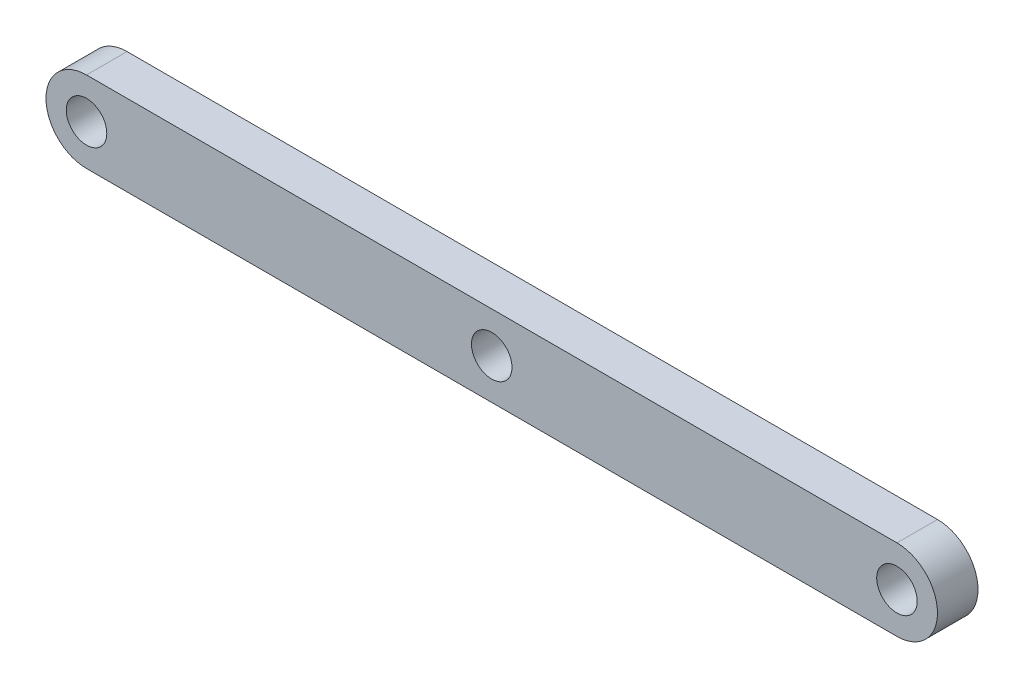
ISO-10303-21;
HEADER;
FILE_DESCRIPTION(('STEP AP214'),'2;1');
FILE_NAME('part.step','',(''),(''),'','','');
FILE_SCHEMA(('AUTOMOTIVE_DESIGN { 1 0 10303 214 1 1 1 1 }'));
ENDSEC;
DATA;
#1=APPLICATION_CONTEXT('core data for automotive mechanical design processes');
#2=APPLICATION_PROTOCOL_DEFINITION('international standard','automotive_design',2000,#1);
#3=PRODUCT_CONTEXT('',#1,'mechanical');
#4=PRODUCT('Part','Part','',(#3));
#5=PRODUCT_RELATED_PRODUCT_CATEGORY('part','',(#4));
#6=PRODUCT_DEFINITION_FORMATION('','',#4);
#7=PRODUCT_DEFINITION_CONTEXT('part definition',#1,'design');
#8=PRODUCT_DEFINITION('design','',#6,#7);
#9=PRODUCT_DEFINITION_SHAPE('','',#8);
#10=(LENGTH_UNIT() NAMED_UNIT(*) SI_UNIT(.MILLI.,.METRE.));
#11=(NAMED_UNIT(*) PLANE_ANGLE_UNIT() SI_UNIT($,.RADIAN.));
#12=(NAMED_UNIT(*) SI_UNIT($,.STERADIAN.) SOLID_ANGLE_UNIT());
#13=UNCERTAINTY_MEASURE_WITH_UNIT(LENGTH_MEASURE(1.E-05),#10,'distance_accuracy_value','');
#14=(GEOMETRIC_REPRESENTATION_CONTEXT(3) GLOBAL_UNCERTAINTY_ASSIGNED_CONTEXT((#13)) GLOBAL_UNIT_ASSIGNED_CONTEXT((#10,
#11,#12)) REPRESENTATION_CONTEXT('',''));
#15=CARTESIAN_POINT('',(0.,0.,0.));
#16=DIRECTION('',(0.,0.,1.));
#17=DIRECTION('',(1.,0.,0.));
#18=AXIS2_PLACEMENT_3D('',#15,#16,#17);
#19=CARTESIAN_POINT('',(-19.999999973377,0.00103195035295043,2.));
#20=DIRECTION('',(0.,0.,1.));
#21=DIRECTION('',(1.,0.,0.));
#22=AXIS2_PLACEMENT_3D('',#19,#20,#21);
#23=PLANE('',#22);
#24=CARTESIAN_POINT('',(20.000000026623,0.00103195035295043,2.));
#25=DIRECTION('',(0.,0.,1.));
#26=DIRECTION('',(1.,0.,0.));
#27=AXIS2_PLACEMENT_3D('',#24,#25,#26);
#28=CIRCLE('',#27,1.);
#29=CARTESIAN_POINT('',(21.000000026623,0.00103195035295043,2.));
#30=VERTEX_POINT('',#29);
#31=EDGE_CURVE('E115',#30,#30,#28,.T.);
#32=ORIENTED_EDGE('',*,*,#31,.F.);
#33=EDGE_LOOP('',(#32));
#34=FACE_BOUND('',#33,.T.);
#35=CARTESIAN_POINT('',(-19.999999973377,0.00103195035295043,2.));
#36=DIRECTION('',(0.,0.,1.));
#37=DIRECTION('',(1.,0.,0.));
#38=AXIS2_PLACEMENT_3D('',#35,#36,#37);
#39=CIRCLE('',#38,2.);
#40=CARTESIAN_POINT('',(-19.999999973377,2.00103195035295,2.));
#41=VERTEX_POINT('',#40);
#42=CARTESIAN_POINT('',(-19.999999973377,-1.99896804964705,2.));
#43=VERTEX_POINT('',#42);
#44=EDGE_CURVE('E85',#41,#43,#39,.T.);
#45=ORIENTED_EDGE('',*,*,#44,.T.);
#46=DIRECTION('',(1.,0.,0.));
#47=VECTOR('',#46,1.);
#48=CARTESIAN_POINT('',(-19.999999973377,-1.99896804964705,2.));
#49=LINE('',#48,#47);
#50=CARTESIAN_POINT('',(20.000000026623,-1.99896804964705,2.));
#51=VERTEX_POINT('',#50);
#52=EDGE_CURVE('E80',#43,#51,#49,.T.);
#53=ORIENTED_EDGE('',*,*,#52,.T.);
#54=CARTESIAN_POINT('',(20.000000026623,0.00103195035295043,2.));
#55=DIRECTION('',(0.,0.,1.));
#56=DIRECTION('',(1.,0.,0.));
#57=AXIS2_PLACEMENT_3D('',#54,#55,#56);
#58=CIRCLE('',#57,2.);
#59=CARTESIAN_POINT('',(20.000000026623,2.00103195035295,2.));
#60=VERTEX_POINT('',#59);
#61=EDGE_CURVE('E83',#51,#60,#58,.T.);
#62=ORIENTED_EDGE('',*,*,#61,.T.);
#63=DIRECTION('',(-1.,0.,0.));
#64=VECTOR('',#63,1.);
#65=CARTESIAN_POINT('',(-19.999999973377,2.00103195035295,2.));
#66=LINE('',#65,#64);
#67=EDGE_CURVE('E50',#60,#41,#66,.T.);
#68=ORIENTED_EDGE('',*,*,#67,.T.);
#69=EDGE_LOOP('',(#45,#53,#62,#68));
#70=FACE_BOUND('',#69,.T.);
#71=CARTESIAN_POINT('',(-19.999999973377,0.00103195035295043,2.));
#72=DIRECTION('',(0.,0.,1.));
#73=DIRECTION('',(1.,0.,0.));
#74=AXIS2_PLACEMENT_3D('',#71,#72,#73);
#75=CIRCLE('',#74,1.);
#76=CARTESIAN_POINT('',(-18.999999973377,0.00103195035295043,2.));
#77=VERTEX_POINT('',#76);
#78=EDGE_CURVE('E100',#77,#77,#75,.T.);
#79=ORIENTED_EDGE('',*,*,#78,.F.);
#80=EDGE_LOOP('',(#79));
#81=FACE_BOUND('',#80,.T.);
#82=CARTESIAN_POINT('',(0.,0.,2.));
#83=DIRECTION('',(0.,0.,1.));
#84=DIRECTION('',(1.,0.,0.));
#85=AXIS2_PLACEMENT_3D('',#82,#83,#84);
#86=CIRCLE('',#85,1.);
#87=CARTESIAN_POINT('',(1.,0.,2.));
#88=VERTEX_POINT('',#87);
#89=EDGE_CURVE('E121',#88,#88,#86,.T.);
#90=ORIENTED_EDGE('',*,*,#89,.F.);
#91=EDGE_LOOP('',(#90));
#92=FACE_BOUND('',#91,.T.);
#93=ADVANCED_FACE('F33',(#34,#70,#81,#92),#23,.T.);
#94=CARTESIAN_POINT('',(-19.999999973377,0.00103195035295043,0.));
#95=DIRECTION('',(0.,0.,1.));
#96=DIRECTION('',(1.,0.,0.));
#97=AXIS2_PLACEMENT_3D('',#94,#95,#96);
#98=PLANE('',#97);
#99=CARTESIAN_POINT('',(-19.999999973377,0.00103195035295043,0.));
#100=DIRECTION('',(0.,0.,1.));
#101=DIRECTION('',(1.,0.,0.));
#102=AXIS2_PLACEMENT_3D('',#99,#100,#101);
#103=CIRCLE('',#102,2.);
#104=CARTESIAN_POINT('',(-19.999999973377,2.00103195035295,0.));
#105=VERTEX_POINT('',#104);
#106=CARTESIAN_POINT('',(-19.999999973377,-1.99896804964705,0.));
#107=VERTEX_POINT('',#106);
#108=EDGE_CURVE('E97',#105,#107,#103,.T.);
#109=ORIENTED_EDGE('',*,*,#108,.F.);
#110=DIRECTION('',(-1.,0.,0.));
#111=VECTOR('',#110,1.);
#112=CARTESIAN_POINT('',(-19.999999973377,2.00103195035295,0.));
#113=LINE('',#112,#111);
#114=CARTESIAN_POINT('',(20.000000026623,2.00103195035295,0.));
#115=VERTEX_POINT('',#114);
#116=EDGE_CURVE('E73',#115,#105,#113,.T.);
#117=ORIENTED_EDGE('',*,*,#116,.F.);
#118=CARTESIAN_POINT('',(20.000000026623,0.00103195035295043,0.));
#119=DIRECTION('',(0.,0.,1.));
#120=DIRECTION('',(1.,0.,0.));
#121=AXIS2_PLACEMENT_3D('',#118,#119,#120);
#122=CIRCLE('',#121,2.);
#123=CARTESIAN_POINT('',(20.000000026623,-1.99896804964705,0.));
#124=VERTEX_POINT('',#123);
#125=EDGE_CURVE('E67',#124,#115,#122,.T.);
#126=ORIENTED_EDGE('',*,*,#125,.F.);
#127=DIRECTION('',(1.,0.,0.));
#128=VECTOR('',#127,1.);
#129=CARTESIAN_POINT('',(-19.999999973377,-1.99896804964705,0.));
#130=LINE('',#129,#128);
#131=EDGE_CURVE('E89',#107,#124,#130,.T.);
#132=ORIENTED_EDGE('',*,*,#131,.F.);
#133=EDGE_LOOP('',(#109,#117,#126,#132));
#134=FACE_BOUND('',#133,.T.);
#135=CARTESIAN_POINT('',(-19.999999973377,0.00103195035295043,0.));
#136=DIRECTION('',(0.,0.,1.));
#137=DIRECTION('',(1.,0.,0.));
#138=AXIS2_PLACEMENT_3D('',#135,#136,#137);
#139=CIRCLE('',#138,1.);
#140=CARTESIAN_POINT('',(-18.999999973377,0.00103195035295043,0.));
#141=VERTEX_POINT('',#140);
#142=EDGE_CURVE('E112',#141,#141,#139,.T.);
#143=ORIENTED_EDGE('',*,*,#142,.T.);
#144=EDGE_LOOP('',(#143));
#145=FACE_BOUND('',#144,.T.);
#146=CARTESIAN_POINT('',(20.000000026623,0.00103195035295043,0.));
#147=DIRECTION('',(0.,0.,1.));
#148=DIRECTION('',(1.,0.,0.));
#149=AXIS2_PLACEMENT_3D('',#146,#147,#148);
#150=CIRCLE('',#149,1.);
#151=CARTESIAN_POINT('',(21.000000026623,0.00103195035295043,0.));
#152=VERTEX_POINT('',#151);
#153=EDGE_CURVE('E118',#152,#152,#150,.T.);
#154=ORIENTED_EDGE('',*,*,#153,.T.);
#155=EDGE_LOOP('',(#154));
#156=FACE_BOUND('',#155,.T.);
#157=CARTESIAN_POINT('',(0.,0.,0.));
#158=DIRECTION('',(0.,0.,1.));
#159=DIRECTION('',(1.,0.,0.));
#160=AXIS2_PLACEMENT_3D('',#157,#158,#159);
#161=CIRCLE('',#160,1.);
#162=CARTESIAN_POINT('',(1.,0.,0.));
#163=VERTEX_POINT('',#162);
#164=EDGE_CURVE('E124',#163,#163,#161,.T.);
#165=ORIENTED_EDGE('',*,*,#164,.T.);
#166=EDGE_LOOP('',(#165));
#167=FACE_BOUND('',#166,.T.);
#168=ADVANCED_FACE('F108',(#134,#145,#156,#167),#98,.F.);
#169=CARTESIAN_POINT('',(-19.999999973377,0.00103195035295043,2.));
#170=DIRECTION('',(0.,0.,-1.));
#171=DIRECTION('',(-1.,0.,0.));
#172=AXIS2_PLACEMENT_3D('',#169,#170,#171);
#173=CYLINDRICAL_SURFACE('',#172,2.);
#174=ORIENTED_EDGE('',*,*,#108,.T.);
#175=DIRECTION('',(0.,0.,-1.));
#176=VECTOR('',#175,1.);
#177=CARTESIAN_POINT('',(-19.999999973377,-1.99896804964705,2.));
#178=LINE('',#177,#176);
#179=EDGE_CURVE('E11',#43,#107,#178,.T.);
#180=ORIENTED_EDGE('',*,*,#179,.F.);
#181=ORIENTED_EDGE('',*,*,#44,.F.);
#182=DIRECTION('',(0.,0.,-1.));
#183=VECTOR('',#182,1.);
#184=CARTESIAN_POINT('',(-19.999999973377,2.00103195035295,2.));
#185=LINE('',#184,#183);
#186=EDGE_CURVE('E93',#41,#105,#185,.T.);
#187=ORIENTED_EDGE('',*,*,#186,.T.);
#188=EDGE_LOOP('',(#174,#180,#181,#187));
#189=FACE_BOUND('',#188,.T.);
#190=ADVANCED_FACE('F35',(#189),#173,.T.);
#191=CARTESIAN_POINT('',(-19.999999973377,-1.99896804964705,2.));
#192=DIRECTION('',(0.,1.,0.));
#193=DIRECTION('',(0.,0.,1.));
#194=AXIS2_PLACEMENT_3D('',#191,#192,#193);
#195=PLANE('',#194);
#196=ORIENTED_EDGE('',*,*,#131,.T.);
#197=DIRECTION('',(0.,0.,-1.));
#198=VECTOR('',#197,1.);
#199=CARTESIAN_POINT('',(20.000000026623,-1.99896804964705,2.));
#200=LINE('',#199,#198);
#201=EDGE_CURVE('E42',#51,#124,#200,.T.);
#202=ORIENTED_EDGE('',*,*,#201,.F.);
#203=ORIENTED_EDGE('',*,*,#52,.F.);
#204=ORIENTED_EDGE('',*,*,#179,.T.);
#205=EDGE_LOOP('',(#196,#202,#203,#204));
#206=FACE_BOUND('',#205,.T.);
#207=ADVANCED_FACE('F88',(#206),#195,.F.);
#208=CARTESIAN_POINT('',(20.000000026623,0.00103195035295043,2.));
#209=DIRECTION('',(0.,0.,-1.));
#210=DIRECTION('',(-1.,0.,0.));
#211=AXIS2_PLACEMENT_3D('',#208,#209,#210);
#212=CYLINDRICAL_SURFACE('',#211,2.);
#213=ORIENTED_EDGE('',*,*,#125,.T.);
#214=DIRECTION('',(0.,0.,-1.));
#215=VECTOR('',#214,1.);
#216=CARTESIAN_POINT('',(20.000000026623,2.00103195035295,2.));
#217=LINE('',#216,#215);
#218=EDGE_CURVE('E90',#60,#115,#217,.T.);
#219=ORIENTED_EDGE('',*,*,#218,.F.);
#220=ORIENTED_EDGE('',*,*,#61,.F.);
#221=ORIENTED_EDGE('',*,*,#201,.T.);
#222=EDGE_LOOP('',(#213,#219,#220,#221));
#223=FACE_BOUND('',#222,.T.);
#224=ADVANCED_FACE('F91',(#223),#212,.T.);
#225=CARTESIAN_POINT('',(-19.999999973377,2.00103195035295,2.));
#226=DIRECTION('',(0.,-1.,0.));
#227=DIRECTION('',(0.,0.,-1.));
#228=AXIS2_PLACEMENT_3D('',#225,#226,#227);
#229=PLANE('',#228);
#230=ORIENTED_EDGE('',*,*,#116,.T.);
#231=ORIENTED_EDGE('',*,*,#186,.F.);
#232=ORIENTED_EDGE('',*,*,#67,.F.);
#233=ORIENTED_EDGE('',*,*,#218,.T.);
#234=EDGE_LOOP('',(#230,#231,#232,#233));
#235=FACE_BOUND('',#234,.T.);
#236=ADVANCED_FACE('F105',(#235),#229,.F.);
#237=CARTESIAN_POINT('',(-19.999999973377,0.00103195035295043,2.));
#238=DIRECTION('',(0.,0.,-1.));
#239=DIRECTION('',(-1.,0.,0.));
#240=AXIS2_PLACEMENT_3D('',#237,#238,#239);
#241=CYLINDRICAL_SURFACE('',#240,1.);
#242=ORIENTED_EDGE('',*,*,#78,.T.);
#243=EDGE_LOOP('',(#242));
#244=FACE_BOUND('',#243,.T.);
#245=ORIENTED_EDGE('',*,*,#142,.F.);
#246=EDGE_LOOP('',(#245));
#247=FACE_BOUND('',#246,.T.);
#248=ADVANCED_FACE('F142',(#244,#247),#241,.F.);
#249=CARTESIAN_POINT('',(20.000000026623,0.00103195035295043,2.));
#250=DIRECTION('',(0.,0.,-1.));
#251=DIRECTION('',(-1.,0.,0.));
#252=AXIS2_PLACEMENT_3D('',#249,#250,#251);
#253=CYLINDRICAL_SURFACE('',#252,1.);
#254=ORIENTED_EDGE('',*,*,#31,.T.);
#255=EDGE_LOOP('',(#254));
#256=FACE_BOUND('',#255,.T.);
#257=ORIENTED_EDGE('',*,*,#153,.F.);
#258=EDGE_LOOP('',(#257));
#259=FACE_BOUND('',#258,.T.);
#260=ADVANCED_FACE('F188',(#256,#259),#253,.F.);
#261=CARTESIAN_POINT('',(0.,0.,2.));
#262=DIRECTION('',(0.,0.,-1.));
#263=DIRECTION('',(-1.,0.,0.));
#264=AXIS2_PLACEMENT_3D('',#261,#262,#263);
#265=CYLINDRICAL_SURFACE('',#264,1.);
#266=ORIENTED_EDGE('',*,*,#89,.T.);
#267=EDGE_LOOP('',(#266));
#268=FACE_BOUND('',#267,.T.);
#269=ORIENTED_EDGE('',*,*,#164,.F.);
#270=EDGE_LOOP('',(#269));
#271=FACE_BOUND('',#270,.T.);
#272=ADVANCED_FACE('F130',(#268,#271),#265,.F.);
#273=CLOSED_SHELL('',(#93,#168,#190,#207,#224,#236,#248,#260,#272));
#274=MANIFOLD_SOLID_BREP('B2',#273);
#275=ADVANCED_BREP_SHAPE_REPRESENTATION('',(#18,#274),#14);
#276=SHAPE_DEFINITION_REPRESENTATION(#9,#275);
ENDSEC;
END-ISO-10303-21;
